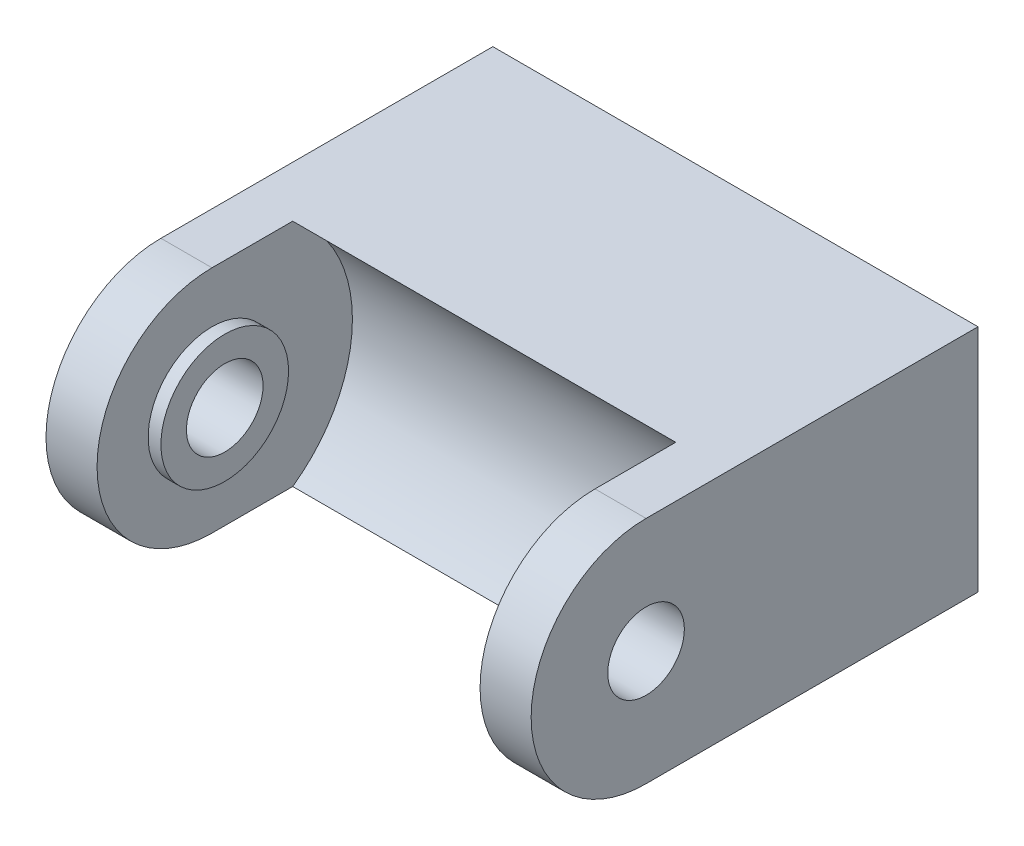
ISO-10303-21;
HEADER;
FILE_DESCRIPTION(('STEP AP214'),'2;1');
FILE_NAME('part.step','',(''),(''),'','','');
FILE_SCHEMA(('AUTOMOTIVE_DESIGN { 1 0 10303 214 1 1 1 1 }'));
ENDSEC;
DATA;
#1=APPLICATION_CONTEXT('core data for automotive mechanical design processes');
#2=APPLICATION_PROTOCOL_DEFINITION('international standard','automotive_design',2000,#1);
#3=PRODUCT_CONTEXT('',#1,'mechanical');
#4=PRODUCT('Part','Part','',(#3));
#5=PRODUCT_RELATED_PRODUCT_CATEGORY('part','',(#4));
#6=PRODUCT_DEFINITION_FORMATION('','',#4);
#7=PRODUCT_DEFINITION_CONTEXT('part definition',#1,'design');
#8=PRODUCT_DEFINITION('design','',#6,#7);
#9=PRODUCT_DEFINITION_SHAPE('','',#8);
#10=(LENGTH_UNIT() NAMED_UNIT(*) SI_UNIT(.MILLI.,.METRE.));
#11=(NAMED_UNIT(*) PLANE_ANGLE_UNIT() SI_UNIT($,.RADIAN.));
#12=(NAMED_UNIT(*) SI_UNIT($,.STERADIAN.) SOLID_ANGLE_UNIT());
#13=UNCERTAINTY_MEASURE_WITH_UNIT(LENGTH_MEASURE(1.E-05),#10,'distance_accuracy_value','');
#14=(GEOMETRIC_REPRESENTATION_CONTEXT(3) GLOBAL_UNCERTAINTY_ASSIGNED_CONTEXT((#13)) GLOBAL_UNIT_ASSIGNED_CONTEXT((#10,
#11,#12)) REPRESENTATION_CONTEXT('',''));
#15=CARTESIAN_POINT('',(0.,0.,0.));
#16=DIRECTION('',(0.,0.,1.));
#17=DIRECTION('',(1.,0.,0.));
#18=AXIS2_PLACEMENT_3D('',#15,#16,#17);
#19=CARTESIAN_POINT('',(-9.5,0.,0.));
#20=DIRECTION('',(1.,0.,0.));
#21=DIRECTION('',(0.,0.,-1.));
#22=AXIS2_PLACEMENT_3D('',#19,#20,#21);
#23=CYLINDRICAL_SURFACE('',#22,4.5);
#24=DIRECTION('',(1.,0.,0.));
#25=VECTOR('',#24,1.);
#26=CARTESIAN_POINT('',(-9.5,-4.5,0.));
#27=LINE('',#26,#25);
#28=CARTESIAN_POINT('',(-9.5,-4.5,0.));
#29=VERTEX_POINT('',#28);
#30=CARTESIAN_POINT('',(-7.5,-4.5,0.));
#31=VERTEX_POINT('',#30);
#32=EDGE_CURVE('E171',#29,#31,#27,.T.);
#33=ORIENTED_EDGE('',*,*,#32,.T.);
#34=CARTESIAN_POINT('',(-7.5,0.,0.));
#35=DIRECTION('',(1.,0.,0.));
#36=DIRECTION('',(0.,0.,-1.));
#37=AXIS2_PLACEMENT_3D('',#34,#35,#36);
#38=CIRCLE('',#37,4.5);
#39=CARTESIAN_POINT('',(-7.5,4.5,0.));
#40=VERTEX_POINT('',#39);
#41=EDGE_CURVE('E116',#31,#40,#38,.F.);
#42=ORIENTED_EDGE('',*,*,#41,.T.);
#43=DIRECTION('',(1.,0.,0.));
#44=VECTOR('',#43,1.);
#45=CARTESIAN_POINT('',(-9.5,4.5,0.));
#46=LINE('',#45,#44);
#47=CARTESIAN_POINT('',(-9.5,4.5,0.));
#48=VERTEX_POINT('',#47);
#49=EDGE_CURVE('E175',#48,#40,#46,.T.);
#50=ORIENTED_EDGE('',*,*,#49,.F.);
#51=CARTESIAN_POINT('',(-9.5,0.,0.));
#52=DIRECTION('',(1.,0.,0.));
#53=DIRECTION('',(0.,0.,-1.));
#54=AXIS2_PLACEMENT_3D('',#51,#52,#53);
#55=CIRCLE('',#54,4.5);
#56=EDGE_CURVE('E160',#48,#29,#55,.T.);
#57=ORIENTED_EDGE('',*,*,#56,.T.);
#58=EDGE_LOOP('',(#33,#42,#50,#57));
#59=FACE_BOUND('',#58,.T.);
#60=ADVANCED_FACE('F35',(#59),#23,.T.);
#61=CARTESIAN_POINT('',(-9.5,4.5,0.));
#62=DIRECTION('',(0.,-1.,0.));
#63=DIRECTION('',(0.,0.,-1.));
#64=AXIS2_PLACEMENT_3D('',#61,#62,#63);
#65=PLANE('',#64);
#66=DIRECTION('',(-1.,0.,0.));
#67=VECTOR('',#66,1.);
#68=CARTESIAN_POINT('',(7.,4.5,-3.16227766016838));
#69=LINE('',#68,#67);
#70=CARTESIAN_POINT('',(7.5,4.5,-3.16227766016838));
#71=VERTEX_POINT('',#70);
#72=CARTESIAN_POINT('',(-7.5,4.5,-3.16227766016838));
#73=VERTEX_POINT('',#72);
#74=EDGE_CURVE('E97',#71,#73,#69,.T.);
#75=ORIENTED_EDGE('',*,*,#74,.F.);
#76=DIRECTION('',(0.,0.,1.));
#77=VECTOR('',#76,1.);
#78=CARTESIAN_POINT('',(7.5,4.5,0.));
#79=LINE('',#78,#77);
#80=CARTESIAN_POINT('',(7.5,4.5,0.));
#81=VERTEX_POINT('',#80);
#82=EDGE_CURVE('E99',#71,#81,#79,.T.);
#83=ORIENTED_EDGE('',*,*,#82,.T.);
#84=CARTESIAN_POINT('',(9.5,4.5,0.));
#85=VERTEX_POINT('',#84);
#86=EDGE_CURVE('E166',#81,#85,#46,.T.);
#87=ORIENTED_EDGE('',*,*,#86,.T.);
#88=DIRECTION('',(0.,0.,-1.));
#89=VECTOR('',#88,1.);
#90=CARTESIAN_POINT('',(9.5,4.5,0.));
#91=LINE('',#90,#89);
#92=CARTESIAN_POINT('',(9.5,4.5,-13.));
#93=VERTEX_POINT('',#92);
#94=EDGE_CURVE('E107',#85,#93,#91,.T.);
#95=ORIENTED_EDGE('',*,*,#94,.T.);
#96=DIRECTION('',(1.,0.,0.));
#97=VECTOR('',#96,1.);
#98=CARTESIAN_POINT('',(-9.5,4.5,-13.));
#99=LINE('',#98,#97);
#100=CARTESIAN_POINT('',(-9.5,4.5,-13.));
#101=VERTEX_POINT('',#100);
#102=EDGE_CURVE('E167',#101,#93,#99,.T.);
#103=ORIENTED_EDGE('',*,*,#102,.F.);
#104=DIRECTION('',(0.,0.,-1.));
#105=VECTOR('',#104,1.);
#106=CARTESIAN_POINT('',(-9.5,4.5,0.));
#107=LINE('',#106,#105);
#108=EDGE_CURVE('E158',#48,#101,#107,.T.);
#109=ORIENTED_EDGE('',*,*,#108,.F.);
#110=ORIENTED_EDGE('',*,*,#49,.T.);
#111=DIRECTION('',(0.,0.,1.));
#112=VECTOR('',#111,1.);
#113=CARTESIAN_POINT('',(-7.5,4.5,0.));
#114=LINE('',#113,#112);
#115=EDGE_CURVE('E102',#73,#40,#114,.T.);
#116=ORIENTED_EDGE('',*,*,#115,.F.);
#117=EDGE_LOOP('',(#75,#83,#87,#95,#103,#109,#110,#116));
#118=FACE_BOUND('',#117,.T.);
#119=ADVANCED_FACE('F37',(#118),#65,.F.);
#120=CARTESIAN_POINT('',(-9.5,-4.5,0.));
#121=DIRECTION('',(0.,1.,0.));
#122=DIRECTION('',(0.,0.,1.));
#123=AXIS2_PLACEMENT_3D('',#120,#121,#122);
#124=PLANE('',#123);
#125=CARTESIAN_POINT('',(7.5,-4.5,0.));
#126=VERTEX_POINT('',#125);
#127=CARTESIAN_POINT('',(9.5,-4.5,0.));
#128=VERTEX_POINT('',#127);
#129=EDGE_CURVE('E174',#126,#128,#27,.T.);
#130=ORIENTED_EDGE('',*,*,#129,.F.);
#131=DIRECTION('',(0.,0.,-1.));
#132=VECTOR('',#131,1.);
#133=CARTESIAN_POINT('',(7.5,-4.5,0.));
#134=LINE('',#133,#132);
#135=CARTESIAN_POINT('',(7.5,-4.5,-3.16227766016838));
#136=VERTEX_POINT('',#135);
#137=EDGE_CURVE('E117',#126,#136,#134,.T.);
#138=ORIENTED_EDGE('',*,*,#137,.T.);
#139=DIRECTION('',(-1.,0.,0.));
#140=VECTOR('',#139,1.);
#141=CARTESIAN_POINT('',(7.,-4.5,-3.16227766016838));
#142=LINE('',#141,#140);
#143=CARTESIAN_POINT('',(-7.5,-4.5,-3.16227766016838));
#144=VERTEX_POINT('',#143);
#145=EDGE_CURVE('E120',#144,#136,#142,.F.);
#146=ORIENTED_EDGE('',*,*,#145,.F.);
#147=DIRECTION('',(0.,0.,-1.));
#148=VECTOR('',#147,1.);
#149=CARTESIAN_POINT('',(-7.5,-4.5,0.));
#150=LINE('',#149,#148);
#151=EDGE_CURVE('E11',#31,#144,#150,.T.);
#152=ORIENTED_EDGE('',*,*,#151,.F.);
#153=ORIENTED_EDGE('',*,*,#32,.F.);
#154=DIRECTION('',(0.,0.,1.));
#155=VECTOR('',#154,1.);
#156=CARTESIAN_POINT('',(-9.5,-4.5,0.));
#157=LINE('',#156,#155);
#158=CARTESIAN_POINT('',(-9.5,-4.5,-13.));
#159=VERTEX_POINT('',#158);
#160=EDGE_CURVE('E163',#159,#29,#157,.T.);
#161=ORIENTED_EDGE('',*,*,#160,.F.);
#162=DIRECTION('',(1.,0.,0.));
#163=VECTOR('',#162,1.);
#164=CARTESIAN_POINT('',(-9.5,-4.5,-13.));
#165=LINE('',#164,#163);
#166=CARTESIAN_POINT('',(9.5,-4.5,-13.));
#167=VERTEX_POINT('',#166);
#168=EDGE_CURVE('E169',#159,#167,#165,.T.);
#169=ORIENTED_EDGE('',*,*,#168,.T.);
#170=DIRECTION('',(0.,0.,1.));
#171=VECTOR('',#170,1.);
#172=CARTESIAN_POINT('',(9.5,-4.5,0.));
#173=LINE('',#172,#171);
#174=EDGE_CURVE('E152',#167,#128,#173,.T.);
#175=ORIENTED_EDGE('',*,*,#174,.T.);
#176=EDGE_LOOP('',(#130,#138,#146,#152,#153,#161,#169,#175));
#177=FACE_BOUND('',#176,.T.);
#178=ADVANCED_FACE('F227',(#177),#124,.F.);
#179=CARTESIAN_POINT('',(7.,0.,0.));
#180=DIRECTION('',(1.,0.,0.));
#181=DIRECTION('',(0.,0.,-1.));
#182=AXIS2_PLACEMENT_3D('',#179,#180,#181);
#183=PLANE('',#182);
#184=CARTESIAN_POINT('',(7.,0.,0.));
#185=DIRECTION('',(1.,0.,0.));
#186=DIRECTION('',(0.,0.,-1.));
#187=AXIS2_PLACEMENT_3D('',#184,#185,#186);
#188=CIRCLE('',#187,1.5);
#189=CARTESIAN_POINT('',(7.,0.,-1.5));
#190=VERTEX_POINT('',#189);
#191=EDGE_CURVE('E108',#190,#190,#188,.T.);
#192=ORIENTED_EDGE('',*,*,#191,.T.);
#193=EDGE_LOOP('',(#192));
#194=FACE_BOUND('',#193,.T.);
#195=CARTESIAN_POINT('',(7.,0.,0.));
#196=DIRECTION('',(1.,0.,0.));
#197=DIRECTION('',(0.,0.,-1.));
#198=AXIS2_PLACEMENT_3D('',#195,#196,#197);
#199=CIRCLE('',#198,2.5);
#200=CARTESIAN_POINT('',(7.,0.,-2.5));
#201=VERTEX_POINT('',#200);
#202=EDGE_CURVE('E125',#201,#201,#199,.F.);
#203=ORIENTED_EDGE('',*,*,#202,.T.);
#204=EDGE_LOOP('',(#203));
#205=FACE_BOUND('',#204,.T.);
#206=ADVANCED_FACE('F188',(#194,#205),#183,.F.);
#207=CARTESIAN_POINT('',(-7.,0.,0.));
#208=DIRECTION('',(1.,0.,0.));
#209=DIRECTION('',(0.,0.,-1.));
#210=AXIS2_PLACEMENT_3D('',#207,#208,#209);
#211=PLANE('',#210);
#212=CARTESIAN_POINT('',(-7.,0.,0.));
#213=DIRECTION('',(1.,0.,0.));
#214=DIRECTION('',(0.,0.,-1.));
#215=AXIS2_PLACEMENT_3D('',#212,#213,#214);
#216=CIRCLE('',#215,1.5);
#217=CARTESIAN_POINT('',(-7.,0.,-1.5));
#218=VERTEX_POINT('',#217);
#219=EDGE_CURVE('E144',#218,#218,#216,.T.);
#220=ORIENTED_EDGE('',*,*,#219,.F.);
#221=EDGE_LOOP('',(#220));
#222=FACE_BOUND('',#221,.T.);
#223=CARTESIAN_POINT('',(-7.,0.,0.));
#224=DIRECTION('',(1.,0.,0.));
#225=DIRECTION('',(0.,0.,-1.));
#226=AXIS2_PLACEMENT_3D('',#223,#224,#225);
#227=CIRCLE('',#226,2.5);
#228=CARTESIAN_POINT('',(-7.,0.,-2.5));
#229=VERTEX_POINT('',#228);
#230=EDGE_CURVE('E121',#229,#229,#227,.F.);
#231=ORIENTED_EDGE('',*,*,#230,.F.);
#232=EDGE_LOOP('',(#231));
#233=FACE_BOUND('',#232,.T.);
#234=ADVANCED_FACE('F184',(#222,#233),#211,.T.);
#235=CARTESIAN_POINT('',(-9.5,0.,-13.));
#236=DIRECTION('',(0.,0.,1.));
#237=DIRECTION('',(1.,0.,0.));
#238=AXIS2_PLACEMENT_3D('',#235,#236,#237);
#239=PLANE('',#238);
#240=CARTESIAN_POINT('',(0.,0.,-13.));
#241=DIRECTION('',(0.,0.,-1.));
#242=DIRECTION('',(-1.,0.,0.));
#243=AXIS2_PLACEMENT_3D('',#240,#241,#242);
#244=CIRCLE('',#243,1.75);
#245=CARTESIAN_POINT('',(-1.75,0.,-13.));
#246=VERTEX_POINT('',#245);
#247=EDGE_CURVE('E206',#246,#246,#244,.T.);
#248=ORIENTED_EDGE('',*,*,#247,.F.);
#249=EDGE_LOOP('',(#248));
#250=FACE_BOUND('',#249,.T.);
#251=ORIENTED_EDGE('',*,*,#102,.T.);
#252=DIRECTION('',(0.,-1.,0.));
#253=VECTOR('',#252,1.);
#254=CARTESIAN_POINT('',(9.5,0.,-13.));
#255=LINE('',#254,#253);
#256=EDGE_CURVE('E155',#93,#167,#255,.T.);
#257=ORIENTED_EDGE('',*,*,#256,.T.);
#258=ORIENTED_EDGE('',*,*,#168,.F.);
#259=DIRECTION('',(0.,-1.,0.));
#260=VECTOR('',#259,1.);
#261=CARTESIAN_POINT('',(-9.5,0.,-13.));
#262=LINE('',#261,#260);
#263=EDGE_CURVE('E50',#101,#159,#262,.T.);
#264=ORIENTED_EDGE('',*,*,#263,.F.);
#265=EDGE_LOOP('',(#251,#257,#258,#264));
#266=FACE_BOUND('',#265,.T.);
#267=ADVANCED_FACE('F187',(#250,#266),#239,.F.);
#268=CARTESIAN_POINT('',(7.5,0.,0.));
#269=DIRECTION('',(1.,0.,0.));
#270=DIRECTION('',(0.,0.,-1.));
#271=AXIS2_PLACEMENT_3D('',#268,#269,#270);
#272=CIRCLE('',#271,4.5);
#273=EDGE_CURVE('E43',#126,#81,#272,.F.);
#274=ORIENTED_EDGE('',*,*,#273,.F.);
#275=ORIENTED_EDGE('',*,*,#129,.T.);
#276=CARTESIAN_POINT('',(9.5,0.,0.));
#277=DIRECTION('',(1.,0.,0.));
#278=DIRECTION('',(0.,0.,-1.));
#279=AXIS2_PLACEMENT_3D('',#276,#277,#278);
#280=CIRCLE('',#279,4.5);
#281=EDGE_CURVE('E149',#85,#128,#280,.T.);
#282=ORIENTED_EDGE('',*,*,#281,.F.);
#283=ORIENTED_EDGE('',*,*,#86,.F.);
#284=EDGE_LOOP('',(#274,#275,#282,#283));
#285=FACE_BOUND('',#284,.T.);
#286=ADVANCED_FACE('F215',(#285),#23,.T.);
#287=CARTESIAN_POINT('',(-9.5,0.,0.));
#288=DIRECTION('',(1.,0.,0.));
#289=DIRECTION('',(0.,0.,-1.));
#290=AXIS2_PLACEMENT_3D('',#287,#288,#289);
#291=PLANE('',#290);
#292=CARTESIAN_POINT('',(-9.5,0.,0.));
#293=DIRECTION('',(1.,0.,0.));
#294=DIRECTION('',(0.,0.,-1.));
#295=AXIS2_PLACEMENT_3D('',#292,#293,#294);
#296=CIRCLE('',#295,1.5);
#297=CARTESIAN_POINT('',(-9.5,0.,-1.5));
#298=VERTEX_POINT('',#297);
#299=EDGE_CURVE('E141',#298,#298,#296,.T.);
#300=ORIENTED_EDGE('',*,*,#299,.T.);
#301=EDGE_LOOP('',(#300));
#302=FACE_BOUND('',#301,.T.);
#303=ORIENTED_EDGE('',*,*,#108,.T.);
#304=ORIENTED_EDGE('',*,*,#263,.T.);
#305=ORIENTED_EDGE('',*,*,#160,.T.);
#306=ORIENTED_EDGE('',*,*,#56,.F.);
#307=EDGE_LOOP('',(#303,#304,#305,#306));
#308=FACE_BOUND('',#307,.T.);
#309=ADVANCED_FACE('F232',(#302,#308),#291,.F.);
#310=CARTESIAN_POINT('',(9.5,0.,0.));
#311=DIRECTION('',(1.,0.,0.));
#312=DIRECTION('',(0.,0.,-1.));
#313=AXIS2_PLACEMENT_3D('',#310,#311,#312);
#314=PLANE('',#313);
#315=CARTESIAN_POINT('',(9.5,0.,0.));
#316=DIRECTION('',(1.,0.,0.));
#317=DIRECTION('',(0.,0.,-1.));
#318=AXIS2_PLACEMENT_3D('',#315,#316,#317);
#319=CIRCLE('',#318,1.5);
#320=CARTESIAN_POINT('',(9.5,0.,-1.5));
#321=VERTEX_POINT('',#320);
#322=EDGE_CURVE('E138',#321,#321,#319,.T.);
#323=ORIENTED_EDGE('',*,*,#322,.F.);
#324=EDGE_LOOP('',(#323));
#325=FACE_BOUND('',#324,.T.);
#326=ORIENTED_EDGE('',*,*,#94,.F.);
#327=ORIENTED_EDGE('',*,*,#281,.T.);
#328=ORIENTED_EDGE('',*,*,#174,.F.);
#329=ORIENTED_EDGE('',*,*,#256,.F.);
#330=EDGE_LOOP('',(#326,#327,#328,#329));
#331=FACE_BOUND('',#330,.T.);
#332=ADVANCED_FACE('F224',(#325,#331),#314,.T.);
#333=CARTESIAN_POINT('',(7.,0.,0.));
#334=DIRECTION('',(-1.,0.,0.));
#335=DIRECTION('',(0.,0.,1.));
#336=AXIS2_PLACEMENT_3D('',#333,#334,#335);
#337=CYLINDRICAL_SURFACE('',#336,5.5);
#338=ORIENTED_EDGE('',*,*,#74,.T.);
#339=CARTESIAN_POINT('',(-7.5,0.,0.));
#340=DIRECTION('',(1.,0.,0.));
#341=DIRECTION('',(0.,0.,-1.));
#342=AXIS2_PLACEMENT_3D('',#339,#340,#341);
#343=CIRCLE('',#342,5.5);
#344=EDGE_CURVE('E128',#144,#73,#343,.T.);
#345=ORIENTED_EDGE('',*,*,#344,.F.);
#346=ORIENTED_EDGE('',*,*,#145,.T.);
#347=CARTESIAN_POINT('',(7.5,0.,0.));
#348=DIRECTION('',(1.,0.,0.));
#349=DIRECTION('',(0.,0.,-1.));
#350=AXIS2_PLACEMENT_3D('',#347,#348,#349);
#351=CIRCLE('',#350,5.5);
#352=EDGE_CURVE('E113',#136,#71,#351,.T.);
#353=ORIENTED_EDGE('',*,*,#352,.T.);
#354=EDGE_LOOP('',(#338,#345,#346,#353));
#355=FACE_BOUND('',#354,.T.);
#356=ADVANCED_FACE('F119',(#355),#337,.F.);
#357=CARTESIAN_POINT('',(-9.5,0.,0.));
#358=DIRECTION('',(1.,0.,0.));
#359=DIRECTION('',(0.,0.,-1.));
#360=AXIS2_PLACEMENT_3D('',#357,#358,#359);
#361=CYLINDRICAL_SURFACE('',#360,1.5);
#362=ORIENTED_EDGE('',*,*,#219,.T.);
#363=EDGE_LOOP('',(#362));
#364=FACE_BOUND('',#363,.T.);
#365=ORIENTED_EDGE('',*,*,#299,.F.);
#366=EDGE_LOOP('',(#365));
#367=FACE_BOUND('',#366,.T.);
#368=ADVANCED_FACE('F181',(#364,#367),#361,.F.);
#369=ORIENTED_EDGE('',*,*,#322,.T.);
#370=EDGE_LOOP('',(#369));
#371=FACE_BOUND('',#370,.T.);
#372=ORIENTED_EDGE('',*,*,#191,.F.);
#373=EDGE_LOOP('',(#372));
#374=FACE_BOUND('',#373,.T.);
#375=ADVANCED_FACE('F196',(#371,#374),#361,.F.);
#376=CARTESIAN_POINT('',(7.5,0.,0.));
#377=DIRECTION('',(-1.,0.,0.));
#378=DIRECTION('',(0.,0.,1.));
#379=AXIS2_PLACEMENT_3D('',#376,#377,#378);
#380=CYLINDRICAL_SURFACE('',#379,2.5);
#381=ORIENTED_EDGE('',*,*,#230,.T.);
#382=EDGE_LOOP('',(#381));
#383=FACE_BOUND('',#382,.T.);
#384=CARTESIAN_POINT('',(-7.5,0.,0.));
#385=DIRECTION('',(1.,0.,0.));
#386=DIRECTION('',(0.,0.,-1.));
#387=AXIS2_PLACEMENT_3D('',#384,#385,#386);
#388=CIRCLE('',#387,2.5);
#389=CARTESIAN_POINT('',(-7.5,0.,-2.5));
#390=VERTEX_POINT('',#389);
#391=EDGE_CURVE('E201',#390,#390,#388,.T.);
#392=ORIENTED_EDGE('',*,*,#391,.T.);
#393=EDGE_LOOP('',(#392));
#394=FACE_BOUND('',#393,.T.);
#395=ADVANCED_FACE('F192',(#383,#394),#380,.T.);
#396=CARTESIAN_POINT('',(-7.5,0.,0.));
#397=DIRECTION('',(1.,0.,0.));
#398=DIRECTION('',(0.,0.,-1.));
#399=AXIS2_PLACEMENT_3D('',#396,#397,#398);
#400=PLANE('',#399);
#401=ORIENTED_EDGE('',*,*,#391,.F.);
#402=EDGE_LOOP('',(#401));
#403=FACE_BOUND('',#402,.T.);
#404=ORIENTED_EDGE('',*,*,#115,.T.);
#405=ORIENTED_EDGE('',*,*,#41,.F.);
#406=ORIENTED_EDGE('',*,*,#151,.T.);
#407=ORIENTED_EDGE('',*,*,#344,.T.);
#408=EDGE_LOOP('',(#404,#405,#406,#407));
#409=FACE_BOUND('',#408,.T.);
#410=ADVANCED_FACE('F195',(#403,#409),#400,.T.);
#411=CARTESIAN_POINT('',(7.5,0.,0.));
#412=DIRECTION('',(1.,0.,0.));
#413=DIRECTION('',(0.,0.,-1.));
#414=AXIS2_PLACEMENT_3D('',#411,#412,#413);
#415=PLANE('',#414);
#416=CARTESIAN_POINT('',(7.5,0.,0.));
#417=DIRECTION('',(1.,0.,0.));
#418=DIRECTION('',(0.,0.,-1.));
#419=AXIS2_PLACEMENT_3D('',#416,#417,#418);
#420=CIRCLE('',#419,2.5);
#421=CARTESIAN_POINT('',(7.5,0.,-2.5));
#422=VERTEX_POINT('',#421);
#423=EDGE_CURVE('E122',#422,#422,#420,.T.);
#424=ORIENTED_EDGE('',*,*,#423,.T.);
#425=EDGE_LOOP('',(#424));
#426=FACE_BOUND('',#425,.T.);
#427=ORIENTED_EDGE('',*,*,#352,.F.);
#428=ORIENTED_EDGE('',*,*,#137,.F.);
#429=ORIENTED_EDGE('',*,*,#273,.T.);
#430=ORIENTED_EDGE('',*,*,#82,.F.);
#431=EDGE_LOOP('',(#427,#428,#429,#430));
#432=FACE_BOUND('',#431,.T.);
#433=ADVANCED_FACE('F112',(#426,#432),#415,.F.);
#434=ORIENTED_EDGE('',*,*,#423,.F.);
#435=EDGE_LOOP('',(#434));
#436=FACE_BOUND('',#435,.T.);
#437=ORIENTED_EDGE('',*,*,#202,.F.);
#438=EDGE_LOOP('',(#437));
#439=FACE_BOUND('',#438,.T.);
#440=ADVANCED_FACE('F198',(#436,#439),#380,.T.);
#441=CARTESIAN_POINT('',(0.,0.,-11.));
#442=DIRECTION('',(0.,0.,-1.));
#443=DIRECTION('',(-1.,0.,0.));
#444=AXIS2_PLACEMENT_3D('',#441,#442,#443);
#445=CYLINDRICAL_SURFACE('',#444,1.75);
#446=CARTESIAN_POINT('',(0.,0.,-11.));
#447=DIRECTION('',(0.,0.,-1.));
#448=DIRECTION('',(-1.,0.,0.));
#449=AXIS2_PLACEMENT_3D('',#446,#447,#448);
#450=CIRCLE('',#449,1.75);
#451=CARTESIAN_POINT('',(-1.75,0.,-11.));
#452=VERTEX_POINT('',#451);
#453=EDGE_CURVE('E203',#452,#452,#450,.T.);
#454=ORIENTED_EDGE('',*,*,#453,.F.);
#455=EDGE_LOOP('',(#454));
#456=FACE_BOUND('',#455,.T.);
#457=ORIENTED_EDGE('',*,*,#247,.T.);
#458=EDGE_LOOP('',(#457));
#459=FACE_BOUND('',#458,.T.);
#460=ADVANCED_FACE('F212',(#456,#459),#445,.F.);
#461=CARTESIAN_POINT('',(0.,0.,-11.));
#462=DIRECTION('',(0.,0.,-1.));
#463=DIRECTION('',(-1.,0.,0.));
#464=AXIS2_PLACEMENT_3D('',#461,#462,#463);
#465=PLANE('',#464);
#466=ORIENTED_EDGE('',*,*,#453,.T.);
#467=EDGE_LOOP('',(#466));
#468=FACE_BOUND('',#467,.T.);
#469=ADVANCED_FACE('F270',(#468),#465,.T.);
#470=CLOSED_SHELL('',(#60,#119,#178,#206,#234,#267,#286,#309,#332,#356,#368,#375,#395,#410,#433,
#440,#460,#469));
#471=MANIFOLD_SOLID_BREP('B2',#470);
#472=ADVANCED_BREP_SHAPE_REPRESENTATION('',(#18,#471),#14);
#473=SHAPE_DEFINITION_REPRESENTATION(#9,#472);
ENDSEC;
END-ISO-10303-21;
